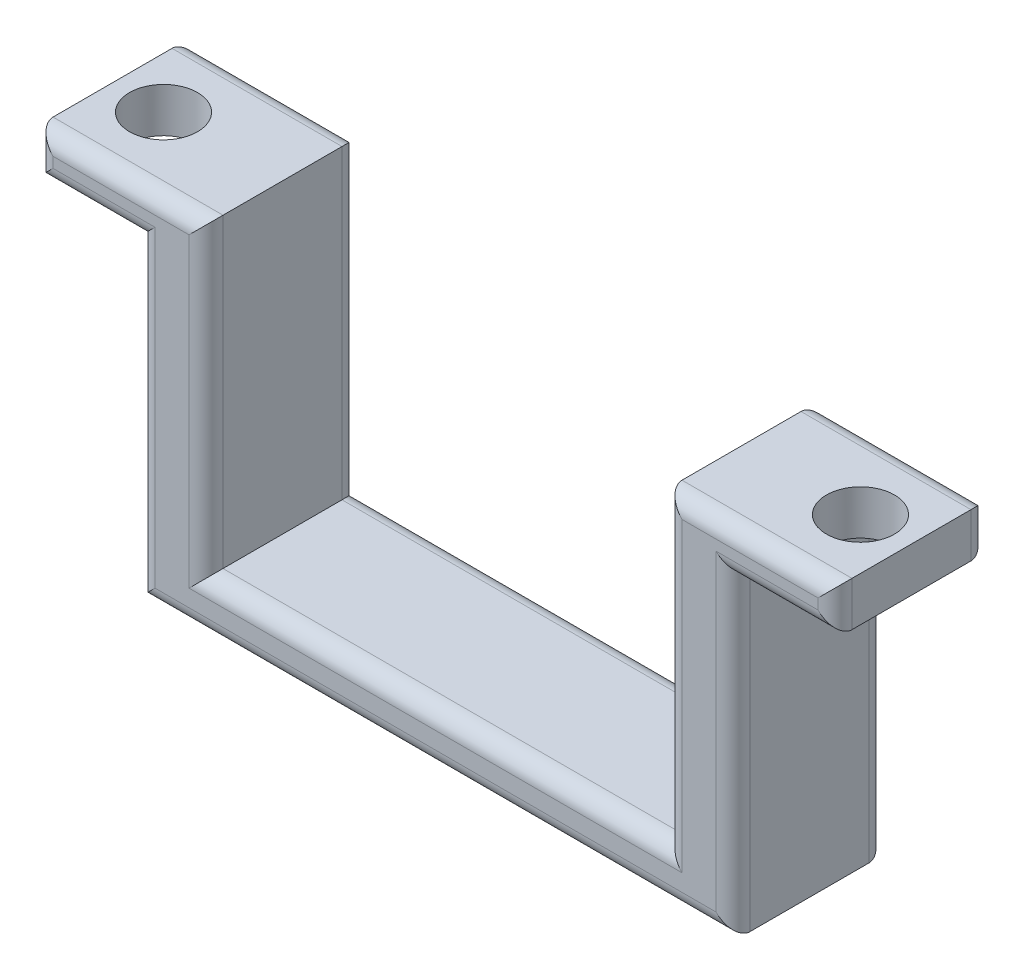
ISO-10303-21;
HEADER;
FILE_DESCRIPTION(('STEP AP214'),'2;1');
FILE_NAME('part.step','',(''),(''),'','','');
FILE_SCHEMA(('AUTOMOTIVE_DESIGN { 1 0 10303 214 1 1 1 1 }'));
ENDSEC;
DATA;
#1=APPLICATION_CONTEXT('core data for automotive mechanical design processes');
#2=APPLICATION_PROTOCOL_DEFINITION('international standard','automotive_design',2000,#1);
#3=PRODUCT_CONTEXT('',#1,'mechanical');
#4=PRODUCT('Part','Part','',(#3));
#5=PRODUCT_RELATED_PRODUCT_CATEGORY('part','',(#4));
#6=PRODUCT_DEFINITION_FORMATION('','',#4);
#7=PRODUCT_DEFINITION_CONTEXT('part definition',#1,'design');
#8=PRODUCT_DEFINITION('design','',#6,#7);
#9=PRODUCT_DEFINITION_SHAPE('','',#8);
#10=(LENGTH_UNIT() NAMED_UNIT(*) SI_UNIT(.MILLI.,.METRE.));
#11=(NAMED_UNIT(*) PLANE_ANGLE_UNIT() SI_UNIT($,.RADIAN.));
#12=(NAMED_UNIT(*) SI_UNIT($,.STERADIAN.) SOLID_ANGLE_UNIT());
#13=UNCERTAINTY_MEASURE_WITH_UNIT(LENGTH_MEASURE(1.E-05),#10,'distance_accuracy_value','');
#14=(GEOMETRIC_REPRESENTATION_CONTEXT(3) GLOBAL_UNCERTAINTY_ASSIGNED_CONTEXT((#13)) GLOBAL_UNIT_ASSIGNED_CONTEXT((#10,
#11,#12)) REPRESENTATION_CONTEXT('',''));
#15=CARTESIAN_POINT('',(0.,0.,0.));
#16=DIRECTION('',(0.,0.,1.));
#17=DIRECTION('',(1.,0.,0.));
#18=AXIS2_PLACEMENT_3D('',#15,#16,#17);
#19=CARTESIAN_POINT('',(0.,-2.61445670320698,9.));
#20=DIRECTION('',(1.,0.,0.));
#21=DIRECTION('',(0.,0.,-1.));
#22=AXIS2_PLACEMENT_3D('',#19,#20,#21);
#23=PLANE('',#22);
#24=DIRECTION('',(0.,0.,-1.));
#25=VECTOR('',#24,1.);
#26=CARTESIAN_POINT('',(0.,0.,9.));
#27=LINE('',#26,#25);
#28=CARTESIAN_POINT('',(0.,0.,8.));
#29=VERTEX_POINT('',#28);
#30=CARTESIAN_POINT('',(0.,0.,0.999999999999999));
#31=VERTEX_POINT('',#30);
#32=EDGE_CURVE('E419',#29,#31,#27,.T.);
#33=ORIENTED_EDGE('',*,*,#32,.T.);
#34=DIRECTION('',(0.,-1.,0.));
#35=VECTOR('',#34,1.);
#36=CARTESIAN_POINT('',(0.,-2.61445670320698,0.999999999999999));
#37=LINE('',#36,#35);
#38=CARTESIAN_POINT('',(0.,-2.61445670320698,0.999999999999999));
#39=VERTEX_POINT('',#38);
#40=EDGE_CURVE('E305',#31,#39,#37,.T.);
#41=ORIENTED_EDGE('',*,*,#40,.T.);
#42=DIRECTION('',(0.,0.,-1.));
#43=VECTOR('',#42,1.);
#44=CARTESIAN_POINT('',(0.,-2.61445670320698,9.));
#45=LINE('',#44,#43);
#46=CARTESIAN_POINT('',(0.,-2.61445670320698,8.));
#47=VERTEX_POINT('',#46);
#48=EDGE_CURVE('E217',#47,#39,#45,.T.);
#49=ORIENTED_EDGE('',*,*,#48,.F.);
#50=DIRECTION('',(0.,-1.,0.));
#51=VECTOR('',#50,1.);
#52=CARTESIAN_POINT('',(0.,-2.61445670320698,8.));
#53=LINE('',#52,#51);
#54=EDGE_CURVE('E303',#47,#29,#53,.F.);
#55=ORIENTED_EDGE('',*,*,#54,.T.);
#56=EDGE_LOOP('',(#33,#41,#49,#55));
#57=FACE_BOUND('',#56,.T.);
#58=ADVANCED_FACE('F33',(#57),#23,.F.);
#59=CARTESIAN_POINT('',(6.,-2.61445670320698,9.));
#60=DIRECTION('',(0.,1.,0.));
#61=DIRECTION('',(-1.,0.,0.));
#62=AXIS2_PLACEMENT_3D('',#59,#60,#61);
#63=PLANE('',#62);
#64=CARTESIAN_POINT('',(3.,-2.61445670320698,4.5));
#65=DIRECTION('',(0.,-1.,0.));
#66=DIRECTION('',(1.,0.,0.));
#67=AXIS2_PLACEMENT_3D('',#64,#65,#66);
#68=CIRCLE('',#67,2.);
#69=CARTESIAN_POINT('',(5.,-2.61445670320698,4.5));
#70=VERTEX_POINT('',#69);
#71=EDGE_CURVE('E420',#70,#70,#68,.T.);
#72=ORIENTED_EDGE('',*,*,#71,.F.);
#73=EDGE_LOOP('',(#72));
#74=FACE_BOUND('',#73,.T.);
#75=ORIENTED_EDGE('',*,*,#48,.T.);
#76=DIRECTION('',(1.,0.,0.));
#77=VECTOR('',#76,1.);
#78=CARTESIAN_POINT('',(6.,-2.61445670320698,0.999999999999999));
#79=LINE('',#78,#77);
#80=CARTESIAN_POINT('',(6.,-2.61445670320698,0.999999999999999));
#81=VERTEX_POINT('',#80);
#82=EDGE_CURVE('E216',#39,#81,#79,.T.);
#83=ORIENTED_EDGE('',*,*,#82,.T.);
#84=DIRECTION('',(0.,0.,-1.));
#85=VECTOR('',#84,1.);
#86=CARTESIAN_POINT('',(6.,-2.61445670320698,9.));
#87=LINE('',#86,#85);
#88=CARTESIAN_POINT('',(6.,-2.61445670320698,8.));
#89=VERTEX_POINT('',#88);
#90=EDGE_CURVE('E198',#89,#81,#87,.T.);
#91=ORIENTED_EDGE('',*,*,#90,.F.);
#92=DIRECTION('',(1.,0.,0.));
#93=VECTOR('',#92,1.);
#94=CARTESIAN_POINT('',(6.,-2.61445670320698,8.));
#95=LINE('',#94,#93);
#96=EDGE_CURVE('E213',#89,#47,#95,.F.);
#97=ORIENTED_EDGE('',*,*,#96,.T.);
#98=EDGE_LOOP('',(#75,#83,#91,#97));
#99=FACE_BOUND('',#98,.T.);
#100=ADVANCED_FACE('F211',(#74,#99),#63,.F.);
#101=CARTESIAN_POINT('',(6.,-21.,9.));
#102=DIRECTION('',(1.,0.,0.));
#103=DIRECTION('',(0.,0.,-1.));
#104=AXIS2_PLACEMENT_3D('',#101,#102,#103);
#105=PLANE('',#104);
#106=ORIENTED_EDGE('',*,*,#90,.T.);
#107=DIRECTION('',(0.,-1.,0.));
#108=VECTOR('',#107,1.);
#109=CARTESIAN_POINT('',(6.,-21.,0.999999999999999));
#110=LINE('',#109,#108);
#111=CARTESIAN_POINT('',(6.,-21.,0.999999999999999));
#112=VERTEX_POINT('',#111);
#113=EDGE_CURVE('E205',#81,#112,#110,.T.);
#114=ORIENTED_EDGE('',*,*,#113,.T.);
#115=DIRECTION('',(0.,0.,-1.));
#116=VECTOR('',#115,1.);
#117=CARTESIAN_POINT('',(6.,-21.,9.));
#118=LINE('',#117,#116);
#119=CARTESIAN_POINT('',(6.,-21.,8.));
#120=VERTEX_POINT('',#119);
#121=EDGE_CURVE('E200',#120,#112,#118,.T.);
#122=ORIENTED_EDGE('',*,*,#121,.F.);
#123=DIRECTION('',(0.,-1.,0.));
#124=VECTOR('',#123,1.);
#125=CARTESIAN_POINT('',(6.,-21.,8.));
#126=LINE('',#125,#124);
#127=EDGE_CURVE('E195',#120,#89,#126,.F.);
#128=ORIENTED_EDGE('',*,*,#127,.T.);
#129=EDGE_LOOP('',(#106,#114,#122,#128));
#130=FACE_BOUND('',#129,.T.);
#131=ADVANCED_FACE('F197',(#130),#105,.F.);
#132=CARTESIAN_POINT('',(41.,-21.,9.));
#133=DIRECTION('',(0.,1.,0.));
#134=DIRECTION('',(-1.,0.,0.));
#135=AXIS2_PLACEMENT_3D('',#132,#133,#134);
#136=PLANE('',#135);
#137=ORIENTED_EDGE('',*,*,#121,.T.);
#138=DIRECTION('',(1.,0.,0.));
#139=VECTOR('',#138,1.);
#140=CARTESIAN_POINT('',(41.,-21.,0.999999999999999));
#141=LINE('',#140,#139);
#142=CARTESIAN_POINT('',(41.,-21.,0.999999999999999));
#143=VERTEX_POINT('',#142);
#144=EDGE_CURVE('E268',#112,#143,#141,.T.);
#145=ORIENTED_EDGE('',*,*,#144,.T.);
#146=DIRECTION('',(0.,0.,-1.));
#147=VECTOR('',#146,1.);
#148=CARTESIAN_POINT('',(41.,-21.,9.));
#149=LINE('',#148,#147);
#150=CARTESIAN_POINT('',(41.,-21.,8.));
#151=VERTEX_POINT('',#150);
#152=EDGE_CURVE('E410',#151,#143,#149,.T.);
#153=ORIENTED_EDGE('',*,*,#152,.F.);
#154=DIRECTION('',(1.,0.,0.));
#155=VECTOR('',#154,1.);
#156=CARTESIAN_POINT('',(41.,-21.,8.));
#157=LINE('',#156,#155);
#158=EDGE_CURVE('E266',#151,#120,#157,.F.);
#159=ORIENTED_EDGE('',*,*,#158,.T.);
#160=EDGE_LOOP('',(#137,#145,#153,#159));
#161=FACE_BOUND('',#160,.T.);
#162=ADVANCED_FACE('F521',(#161),#136,.F.);
#163=CARTESIAN_POINT('',(41.,-2.61445670320697,9.));
#164=DIRECTION('',(-1.,0.,0.));
#165=DIRECTION('',(0.,0.,1.));
#166=AXIS2_PLACEMENT_3D('',#163,#164,#165);
#167=PLANE('',#166);
#168=ORIENTED_EDGE('',*,*,#152,.T.);
#169=DIRECTION('',(0.,1.,0.));
#170=VECTOR('',#169,1.);
#171=CARTESIAN_POINT('',(41.,-2.61445670320697,0.999999999999999));
#172=LINE('',#171,#170);
#173=CARTESIAN_POINT('',(41.,-2.61445670320697,0.999999999999999));
#174=VERTEX_POINT('',#173);
#175=EDGE_CURVE('E272',#143,#174,#172,.T.);
#176=ORIENTED_EDGE('',*,*,#175,.T.);
#177=DIRECTION('',(0.,0.,-1.));
#178=VECTOR('',#177,1.);
#179=CARTESIAN_POINT('',(41.,-2.61445670320697,9.));
#180=LINE('',#179,#178);
#181=CARTESIAN_POINT('',(41.,-2.61445670320697,8.));
#182=VERTEX_POINT('',#181);
#183=EDGE_CURVE('E401',#182,#174,#180,.T.);
#184=ORIENTED_EDGE('',*,*,#183,.F.);
#185=DIRECTION('',(0.,1.,0.));
#186=VECTOR('',#185,1.);
#187=CARTESIAN_POINT('',(41.,-2.61445670320697,8.));
#188=LINE('',#187,#186);
#189=EDGE_CURVE('E270',#182,#151,#188,.F.);
#190=ORIENTED_EDGE('',*,*,#189,.T.);
#191=EDGE_LOOP('',(#168,#176,#184,#190));
#192=FACE_BOUND('',#191,.T.);
#193=ADVANCED_FACE('F407',(#192),#167,.F.);
#194=CARTESIAN_POINT('',(47.,-2.61445670320697,9.));
#195=DIRECTION('',(0.,1.,0.));
#196=DIRECTION('',(-1.,0.,0.));
#197=AXIS2_PLACEMENT_3D('',#194,#195,#196);
#198=PLANE('',#197);
#199=CARTESIAN_POINT('',(44.,-2.61445670320698,4.5));
#200=DIRECTION('',(0.,1.,0.));
#201=DIRECTION('',(-1.,0.,0.));
#202=AXIS2_PLACEMENT_3D('',#199,#200,#201);
#203=CIRCLE('',#202,2.);
#204=CARTESIAN_POINT('',(42.,-2.61445670320698,4.5));
#205=VERTEX_POINT('',#204);
#206=EDGE_CURVE('E360',#205,#205,#203,.T.);
#207=ORIENTED_EDGE('',*,*,#206,.T.);
#208=EDGE_LOOP('',(#207));
#209=FACE_BOUND('',#208,.T.);
#210=ORIENTED_EDGE('',*,*,#183,.T.);
#211=DIRECTION('',(1.,0.,0.));
#212=VECTOR('',#211,1.);
#213=CARTESIAN_POINT('',(47.,-2.61445670320697,0.999999999999999));
#214=LINE('',#213,#212);
#215=CARTESIAN_POINT('',(47.,-2.61445670320697,0.999999999999999));
#216=VERTEX_POINT('',#215);
#217=EDGE_CURVE('E276',#174,#216,#214,.T.);
#218=ORIENTED_EDGE('',*,*,#217,.T.);
#219=DIRECTION('',(0.,0.,-1.));
#220=VECTOR('',#219,1.);
#221=CARTESIAN_POINT('',(47.,-2.61445670320697,9.));
#222=LINE('',#221,#220);
#223=CARTESIAN_POINT('',(47.,-2.61445670320697,8.));
#224=VERTEX_POINT('',#223);
#225=EDGE_CURVE('E404',#224,#216,#222,.T.);
#226=ORIENTED_EDGE('',*,*,#225,.F.);
#227=DIRECTION('',(1.,0.,0.));
#228=VECTOR('',#227,1.);
#229=CARTESIAN_POINT('',(47.,-2.61445670320697,8.));
#230=LINE('',#229,#228);
#231=EDGE_CURVE('E274',#224,#182,#230,.F.);
#232=ORIENTED_EDGE('',*,*,#231,.T.);
#233=EDGE_LOOP('',(#210,#218,#226,#232));
#234=FACE_BOUND('',#233,.T.);
#235=ADVANCED_FACE('F400',(#209,#234),#198,.F.);
#236=CARTESIAN_POINT('',(47.,0.,9.));
#237=DIRECTION('',(-1.,0.,0.));
#238=DIRECTION('',(0.,0.,1.));
#239=AXIS2_PLACEMENT_3D('',#236,#237,#238);
#240=PLANE('',#239);
#241=ORIENTED_EDGE('',*,*,#225,.T.);
#242=DIRECTION('',(0.,1.,0.));
#243=VECTOR('',#242,1.);
#244=CARTESIAN_POINT('',(47.,0.,0.999999999999999));
#245=LINE('',#244,#243);
#246=CARTESIAN_POINT('',(47.,0.,0.999999999999999));
#247=VERTEX_POINT('',#246);
#248=EDGE_CURVE('E280',#216,#247,#245,.T.);
#249=ORIENTED_EDGE('',*,*,#248,.T.);
#250=DIRECTION('',(0.,0.,-1.));
#251=VECTOR('',#250,1.);
#252=CARTESIAN_POINT('',(47.,0.,9.));
#253=LINE('',#252,#251);
#254=CARTESIAN_POINT('',(47.,0.,8.));
#255=VERTEX_POINT('',#254);
#256=EDGE_CURVE('E413',#255,#247,#253,.T.);
#257=ORIENTED_EDGE('',*,*,#256,.F.);
#258=DIRECTION('',(0.,1.,0.));
#259=VECTOR('',#258,1.);
#260=CARTESIAN_POINT('',(47.,0.,8.));
#261=LINE('',#260,#259);
#262=EDGE_CURVE('E278',#255,#224,#261,.F.);
#263=ORIENTED_EDGE('',*,*,#262,.T.);
#264=EDGE_LOOP('',(#241,#249,#257,#263));
#265=FACE_BOUND('',#264,.T.);
#266=ADVANCED_FACE('F532',(#265),#240,.F.);
#267=CARTESIAN_POINT('',(37.,0.,9.));
#268=DIRECTION('',(0.,-1.,0.));
#269=DIRECTION('',(0.,0.,-1.));
#270=AXIS2_PLACEMENT_3D('',#267,#268,#269);
#271=PLANE('',#270);
#272=CARTESIAN_POINT('',(44.,0.,4.5));
#273=DIRECTION('',(0.,-1.,0.));
#274=DIRECTION('',(0.,0.,-1.));
#275=AXIS2_PLACEMENT_3D('',#272,#273,#274);
#276=CIRCLE('',#275,2.);
#277=CARTESIAN_POINT('',(44.,0.,2.5));
#278=VERTEX_POINT('',#277);
#279=EDGE_CURVE('E239',#278,#278,#276,.F.);
#280=ORIENTED_EDGE('',*,*,#279,.F.);
#281=EDGE_LOOP('',(#280));
#282=FACE_BOUND('',#281,.T.);
#283=ORIENTED_EDGE('',*,*,#256,.T.);
#284=DIRECTION('',(-1.,0.,0.));
#285=VECTOR('',#284,1.);
#286=CARTESIAN_POINT('',(37.,0.,0.999999999999999));
#287=LINE('',#286,#285);
#288=CARTESIAN_POINT('',(37.,0.,0.999999999999999));
#289=VERTEX_POINT('',#288);
#290=EDGE_CURVE('E284',#247,#289,#287,.T.);
#291=ORIENTED_EDGE('',*,*,#290,.T.);
#292=DIRECTION('',(0.,0.,-1.));
#293=VECTOR('',#292,1.);
#294=CARTESIAN_POINT('',(37.,0.,9.));
#295=LINE('',#294,#293);
#296=CARTESIAN_POINT('',(37.,0.,8.));
#297=VERTEX_POINT('',#296);
#298=EDGE_CURVE('E441',#297,#289,#295,.T.);
#299=ORIENTED_EDGE('',*,*,#298,.F.);
#300=DIRECTION('',(-1.,0.,0.));
#301=VECTOR('',#300,1.);
#302=CARTESIAN_POINT('',(37.,0.,8.));
#303=LINE('',#302,#301);
#304=EDGE_CURVE('E282',#297,#255,#303,.F.);
#305=ORIENTED_EDGE('',*,*,#304,.T.);
#306=EDGE_LOOP('',(#283,#291,#299,#305));
#307=FACE_BOUND('',#306,.T.);
#308=ADVANCED_FACE('F447',(#282,#307),#271,.F.);
#309=CARTESIAN_POINT('',(37.,-18.,9.));
#310=DIRECTION('',(1.,0.,0.));
#311=DIRECTION('',(0.,0.,-1.));
#312=AXIS2_PLACEMENT_3D('',#309,#310,#311);
#313=PLANE('',#312);
#314=ORIENTED_EDGE('',*,*,#298,.T.);
#315=DIRECTION('',(0.,-1.,0.));
#316=VECTOR('',#315,1.);
#317=CARTESIAN_POINT('',(37.,-18.,0.999999999999999));
#318=LINE('',#317,#316);
#319=CARTESIAN_POINT('',(37.,-18.,0.999999999999999));
#320=VERTEX_POINT('',#319);
#321=EDGE_CURVE('E288',#289,#320,#318,.T.);
#322=ORIENTED_EDGE('',*,*,#321,.T.);
#323=DIRECTION('',(0.,0.,-1.));
#324=VECTOR('',#323,1.);
#325=CARTESIAN_POINT('',(37.,-18.,9.));
#326=LINE('',#325,#324);
#327=CARTESIAN_POINT('',(37.,-18.,8.));
#328=VERTEX_POINT('',#327);
#329=EDGE_CURVE('E438',#328,#320,#326,.T.);
#330=ORIENTED_EDGE('',*,*,#329,.F.);
#331=DIRECTION('',(0.,-1.,0.));
#332=VECTOR('',#331,1.);
#333=CARTESIAN_POINT('',(37.,-18.,8.));
#334=LINE('',#333,#332);
#335=EDGE_CURVE('E286',#328,#297,#334,.F.);
#336=ORIENTED_EDGE('',*,*,#335,.T.);
#337=EDGE_LOOP('',(#314,#322,#330,#336));
#338=FACE_BOUND('',#337,.T.);
#339=ADVANCED_FACE('F473',(#338),#313,.F.);
#340=CARTESIAN_POINT('',(10.,-18.,9.));
#341=DIRECTION('',(0.,-1.,0.));
#342=DIRECTION('',(0.,0.,-1.));
#343=AXIS2_PLACEMENT_3D('',#340,#341,#342);
#344=PLANE('',#343);
#345=ORIENTED_EDGE('',*,*,#329,.T.);
#346=DIRECTION('',(-1.,0.,0.));
#347=VECTOR('',#346,1.);
#348=CARTESIAN_POINT('',(10.,-18.,0.999999999999999));
#349=LINE('',#348,#347);
#350=CARTESIAN_POINT('',(10.,-18.,0.999999999999999));
#351=VERTEX_POINT('',#350);
#352=EDGE_CURVE('E292',#320,#351,#349,.T.);
#353=ORIENTED_EDGE('',*,*,#352,.T.);
#354=DIRECTION('',(0.,0.,-1.));
#355=VECTOR('',#354,1.);
#356=CARTESIAN_POINT('',(10.,-18.,9.));
#357=LINE('',#356,#355);
#358=CARTESIAN_POINT('',(10.,-18.,8.));
#359=VERTEX_POINT('',#358);
#360=EDGE_CURVE('E435',#359,#351,#357,.T.);
#361=ORIENTED_EDGE('',*,*,#360,.F.);
#362=DIRECTION('',(-1.,0.,0.));
#363=VECTOR('',#362,1.);
#364=CARTESIAN_POINT('',(10.,-18.,8.));
#365=LINE('',#364,#363);
#366=EDGE_CURVE('E290',#359,#328,#365,.F.);
#367=ORIENTED_EDGE('',*,*,#366,.T.);
#368=EDGE_LOOP('',(#345,#353,#361,#367));
#369=FACE_BOUND('',#368,.T.);
#370=ADVANCED_FACE('F476',(#369),#344,.F.);
#371=CARTESIAN_POINT('',(10.,0.,9.));
#372=DIRECTION('',(-1.,0.,0.));
#373=DIRECTION('',(0.,-1.,0.));
#374=AXIS2_PLACEMENT_3D('',#371,#372,#373);
#375=PLANE('',#374);
#376=ORIENTED_EDGE('',*,*,#360,.T.);
#377=DIRECTION('',(0.,1.,0.));
#378=VECTOR('',#377,1.);
#379=CARTESIAN_POINT('',(10.,0.,0.999999999999999));
#380=LINE('',#379,#378);
#381=CARTESIAN_POINT('',(10.,0.,0.999999999999999));
#382=VERTEX_POINT('',#381);
#383=EDGE_CURVE('E296',#351,#382,#380,.T.);
#384=ORIENTED_EDGE('',*,*,#383,.T.);
#385=DIRECTION('',(0.,0.,-1.));
#386=VECTOR('',#385,1.);
#387=CARTESIAN_POINT('',(10.,0.,9.));
#388=LINE('',#387,#386);
#389=CARTESIAN_POINT('',(10.,0.,8.));
#390=VERTEX_POINT('',#389);
#391=EDGE_CURVE('E424',#390,#382,#388,.T.);
#392=ORIENTED_EDGE('',*,*,#391,.F.);
#393=DIRECTION('',(0.,1.,0.));
#394=VECTOR('',#393,1.);
#395=CARTESIAN_POINT('',(10.,0.,8.));
#396=LINE('',#395,#394);
#397=EDGE_CURVE('E294',#390,#359,#396,.F.);
#398=ORIENTED_EDGE('',*,*,#397,.T.);
#399=EDGE_LOOP('',(#376,#384,#392,#398));
#400=FACE_BOUND('',#399,.T.);
#401=ADVANCED_FACE('F693',(#400),#375,.F.);
#402=CARTESIAN_POINT('',(0.,0.,9.));
#403=DIRECTION('',(0.,-1.,0.));
#404=DIRECTION('',(0.,0.,-1.));
#405=AXIS2_PLACEMENT_3D('',#402,#403,#404);
#406=PLANE('',#405);
#407=CARTESIAN_POINT('',(3.,0.,4.5));
#408=DIRECTION('',(0.,-1.,0.));
#409=DIRECTION('',(0.,0.,-1.));
#410=AXIS2_PLACEMENT_3D('',#407,#408,#409);
#411=CIRCLE('',#410,2.);
#412=CARTESIAN_POINT('',(3.,0.,2.5));
#413=VERTEX_POINT('',#412);
#414=EDGE_CURVE('E417',#413,#413,#411,.T.);
#415=ORIENTED_EDGE('',*,*,#414,.T.);
#416=EDGE_LOOP('',(#415));
#417=FACE_BOUND('',#416,.T.);
#418=ORIENTED_EDGE('',*,*,#391,.T.);
#419=DIRECTION('',(-1.,0.,0.));
#420=VECTOR('',#419,1.);
#421=CARTESIAN_POINT('',(0.,0.,0.999999999999999));
#422=LINE('',#421,#420);
#423=EDGE_CURVE('E301',#382,#31,#422,.T.);
#424=ORIENTED_EDGE('',*,*,#423,.T.);
#425=ORIENTED_EDGE('',*,*,#32,.F.);
#426=DIRECTION('',(-1.,0.,0.));
#427=VECTOR('',#426,1.);
#428=CARTESIAN_POINT('',(0.,0.,8.));
#429=LINE('',#428,#427);
#430=EDGE_CURVE('E298',#29,#390,#429,.F.);
#431=ORIENTED_EDGE('',*,*,#430,.T.);
#432=EDGE_LOOP('',(#418,#424,#425,#431));
#433=FACE_BOUND('',#432,.T.);
#434=ADVANCED_FACE('F498',(#417,#433),#406,.F.);
#435=CARTESIAN_POINT('',(0.,0.,9.));
#436=DIRECTION('',(0.,0.,-1.));
#437=DIRECTION('',(-1.,0.,0.));
#438=AXIS2_PLACEMENT_3D('',#435,#436,#437);
#439=PLANE('',#438);
#440=DIRECTION('',(0.,1.,0.));
#441=VECTOR('',#440,1.);
#442=CARTESIAN_POINT('',(9.,0.,9.));
#443=LINE('',#442,#441);
#444=CARTESIAN_POINT('',(9.,-19.,9.));
#445=VERTEX_POINT('',#444);
#446=CARTESIAN_POINT('',(9.,-1.,9.));
#447=VERTEX_POINT('',#446);
#448=EDGE_CURVE('E42',#445,#447,#443,.T.);
#449=ORIENTED_EDGE('',*,*,#448,.T.);
#450=DIRECTION('',(-1.,0.,0.));
#451=VECTOR('',#450,1.);
#452=CARTESIAN_POINT('',(0.,-1.,9.));
#453=LINE('',#452,#451);
#454=CARTESIAN_POINT('',(1.,-1.,9.));
#455=VERTEX_POINT('',#454);
#456=EDGE_CURVE('E11',#447,#455,#453,.T.);
#457=ORIENTED_EDGE('',*,*,#456,.T.);
#458=DIRECTION('',(0.,-1.,0.));
#459=VECTOR('',#458,1.);
#460=CARTESIAN_POINT('',(1.,0.,9.));
#461=LINE('',#460,#459);
#462=CARTESIAN_POINT('',(1.,-1.61445670320698,9.));
#463=VERTEX_POINT('',#462);
#464=EDGE_CURVE('E307',#455,#463,#461,.T.);
#465=ORIENTED_EDGE('',*,*,#464,.T.);
#466=DIRECTION('',(1.,0.,0.));
#467=VECTOR('',#466,1.);
#468=CARTESIAN_POINT('',(0.,-1.61445670320698,9.));
#469=LINE('',#468,#467);
#470=CARTESIAN_POINT('',(7.,-1.61445670320698,9.));
#471=VERTEX_POINT('',#470);
#472=EDGE_CURVE('E309',#463,#471,#469,.T.);
#473=ORIENTED_EDGE('',*,*,#472,.T.);
#474=DIRECTION('',(0.,-1.,0.));
#475=VECTOR('',#474,1.);
#476=CARTESIAN_POINT('',(7.,0.,9.));
#477=LINE('',#476,#475);
#478=CARTESIAN_POINT('',(7.,-20.,9.));
#479=VERTEX_POINT('',#478);
#480=EDGE_CURVE('E223',#471,#479,#477,.T.);
#481=ORIENTED_EDGE('',*,*,#480,.T.);
#482=DIRECTION('',(1.,0.,0.));
#483=VECTOR('',#482,1.);
#484=CARTESIAN_POINT('',(0.,-20.,9.));
#485=LINE('',#484,#483);
#486=CARTESIAN_POINT('',(40.,-20.,9.));
#487=VERTEX_POINT('',#486);
#488=EDGE_CURVE('E312',#479,#487,#485,.T.);
#489=ORIENTED_EDGE('',*,*,#488,.T.);
#490=DIRECTION('',(0.,1.,0.));
#491=VECTOR('',#490,1.);
#492=CARTESIAN_POINT('',(40.,0.,9.));
#493=LINE('',#492,#491);
#494=CARTESIAN_POINT('',(40.,-1.61445670320697,9.));
#495=VERTEX_POINT('',#494);
#496=EDGE_CURVE('E314',#487,#495,#493,.T.);
#497=ORIENTED_EDGE('',*,*,#496,.T.);
#498=DIRECTION('',(1.,0.,0.));
#499=VECTOR('',#498,1.);
#500=CARTESIAN_POINT('',(0.,-1.61445670320698,9.));
#501=LINE('',#500,#499);
#502=CARTESIAN_POINT('',(46.,-1.61445670320697,9.));
#503=VERTEX_POINT('',#502);
#504=EDGE_CURVE('E316',#495,#503,#501,.T.);
#505=ORIENTED_EDGE('',*,*,#504,.T.);
#506=DIRECTION('',(0.,1.,0.));
#507=VECTOR('',#506,1.);
#508=CARTESIAN_POINT('',(46.,0.,9.));
#509=LINE('',#508,#507);
#510=CARTESIAN_POINT('',(46.,-1.,9.));
#511=VERTEX_POINT('',#510);
#512=EDGE_CURVE('E318',#503,#511,#509,.T.);
#513=ORIENTED_EDGE('',*,*,#512,.T.);
#514=DIRECTION('',(-1.,0.,0.));
#515=VECTOR('',#514,1.);
#516=CARTESIAN_POINT('',(0.,-1.,9.));
#517=LINE('',#516,#515);
#518=CARTESIAN_POINT('',(38.,-1.,9.));
#519=VERTEX_POINT('',#518);
#520=EDGE_CURVE('E320',#511,#519,#517,.T.);
#521=ORIENTED_EDGE('',*,*,#520,.T.);
#522=DIRECTION('',(0.,-1.,0.));
#523=VECTOR('',#522,1.);
#524=CARTESIAN_POINT('',(38.,0.,9.));
#525=LINE('',#524,#523);
#526=CARTESIAN_POINT('',(38.,-19.,9.));
#527=VERTEX_POINT('',#526);
#528=EDGE_CURVE('E322',#519,#527,#525,.T.);
#529=ORIENTED_EDGE('',*,*,#528,.T.);
#530=DIRECTION('',(-1.,0.,0.));
#531=VECTOR('',#530,1.);
#532=CARTESIAN_POINT('',(0.,-19.,9.));
#533=LINE('',#532,#531);
#534=EDGE_CURVE('E53',#527,#445,#533,.T.);
#535=ORIENTED_EDGE('',*,*,#534,.T.);
#536=EDGE_LOOP('',(#449,#457,#465,#473,#481,#489,#497,#505,#513,#521,#529,#535));
#537=FACE_BOUND('',#536,.T.);
#538=ADVANCED_FACE('F491',(#537),#439,.F.);
#539=CARTESIAN_POINT('',(0.,0.,0.));
#540=DIRECTION('',(0.,0.,-1.));
#541=DIRECTION('',(-1.,0.,0.));
#542=AXIS2_PLACEMENT_3D('',#539,#540,#541);
#543=PLANE('',#542);
#544=DIRECTION('',(0.,-1.,0.));
#545=VECTOR('',#544,1.);
#546=CARTESIAN_POINT('',(7.,-2.61445670320698,0.));
#547=LINE('',#546,#545);
#548=CARTESIAN_POINT('',(7.,-20.,0.));
#549=VERTEX_POINT('',#548);
#550=CARTESIAN_POINT('',(7.,-1.61445670320698,0.));
#551=VERTEX_POINT('',#550);
#552=EDGE_CURVE('E261',#549,#551,#547,.F.);
#553=ORIENTED_EDGE('',*,*,#552,.T.);
#554=DIRECTION('',(1.,0.,0.));
#555=VECTOR('',#554,1.);
#556=CARTESIAN_POINT('',(0.,-1.61445670320698,0.));
#557=LINE('',#556,#555);
#558=CARTESIAN_POINT('',(1.,-1.61445670320698,0.));
#559=VERTEX_POINT('',#558);
#560=EDGE_CURVE('E206',#551,#559,#557,.F.);
#561=ORIENTED_EDGE('',*,*,#560,.T.);
#562=DIRECTION('',(0.,-1.,0.));
#563=VECTOR('',#562,1.);
#564=CARTESIAN_POINT('',(1.,0.,0.));
#565=LINE('',#564,#563);
#566=CARTESIAN_POINT('',(1.,-1.,0.));
#567=VERTEX_POINT('',#566);
#568=EDGE_CURVE('E235',#559,#567,#565,.F.);
#569=ORIENTED_EDGE('',*,*,#568,.T.);
#570=DIRECTION('',(-1.,0.,0.));
#571=VECTOR('',#570,1.);
#572=CARTESIAN_POINT('',(10.,-1.,0.));
#573=LINE('',#572,#571);
#574=CARTESIAN_POINT('',(9.,-1.,0.));
#575=VERTEX_POINT('',#574);
#576=EDGE_CURVE('E243',#567,#575,#573,.F.);
#577=ORIENTED_EDGE('',*,*,#576,.T.);
#578=DIRECTION('',(0.,1.,0.));
#579=VECTOR('',#578,1.);
#580=CARTESIAN_POINT('',(9.,-18.,0.));
#581=LINE('',#580,#579);
#582=CARTESIAN_POINT('',(9.,-19.,0.));
#583=VERTEX_POINT('',#582);
#584=EDGE_CURVE('E245',#575,#583,#581,.F.);
#585=ORIENTED_EDGE('',*,*,#584,.T.);
#586=DIRECTION('',(-1.,0.,0.));
#587=VECTOR('',#586,1.);
#588=CARTESIAN_POINT('',(37.,-19.,0.));
#589=LINE('',#588,#587);
#590=CARTESIAN_POINT('',(38.,-19.,0.));
#591=VERTEX_POINT('',#590);
#592=EDGE_CURVE('E247',#583,#591,#589,.F.);
#593=ORIENTED_EDGE('',*,*,#592,.T.);
#594=DIRECTION('',(0.,-1.,0.));
#595=VECTOR('',#594,1.);
#596=CARTESIAN_POINT('',(38.,0.,0.));
#597=LINE('',#596,#595);
#598=CARTESIAN_POINT('',(38.,-1.,0.));
#599=VERTEX_POINT('',#598);
#600=EDGE_CURVE('E249',#591,#599,#597,.F.);
#601=ORIENTED_EDGE('',*,*,#600,.T.);
#602=DIRECTION('',(-1.,0.,0.));
#603=VECTOR('',#602,1.);
#604=CARTESIAN_POINT('',(47.,-1.,0.));
#605=LINE('',#604,#603);
#606=CARTESIAN_POINT('',(46.,-1.,0.));
#607=VERTEX_POINT('',#606);
#608=EDGE_CURVE('E251',#599,#607,#605,.F.);
#609=ORIENTED_EDGE('',*,*,#608,.T.);
#610=DIRECTION('',(0.,1.,0.));
#611=VECTOR('',#610,1.);
#612=CARTESIAN_POINT('',(46.,-2.61445670320697,0.));
#613=LINE('',#612,#611);
#614=CARTESIAN_POINT('',(46.,-1.61445670320697,0.));
#615=VERTEX_POINT('',#614);
#616=EDGE_CURVE('E253',#607,#615,#613,.F.);
#617=ORIENTED_EDGE('',*,*,#616,.T.);
#618=DIRECTION('',(1.,0.,0.));
#619=VECTOR('',#618,1.);
#620=CARTESIAN_POINT('',(41.,-1.61445670320697,0.));
#621=LINE('',#620,#619);
#622=CARTESIAN_POINT('',(40.,-1.61445670320697,0.));
#623=VERTEX_POINT('',#622);
#624=EDGE_CURVE('E255',#615,#623,#621,.F.);
#625=ORIENTED_EDGE('',*,*,#624,.T.);
#626=DIRECTION('',(0.,1.,0.));
#627=VECTOR('',#626,1.);
#628=CARTESIAN_POINT('',(40.,-21.,0.));
#629=LINE('',#628,#627);
#630=CARTESIAN_POINT('',(40.,-20.,0.));
#631=VERTEX_POINT('',#630);
#632=EDGE_CURVE('E257',#623,#631,#629,.F.);
#633=ORIENTED_EDGE('',*,*,#632,.T.);
#634=DIRECTION('',(1.,0.,0.));
#635=VECTOR('',#634,1.);
#636=CARTESIAN_POINT('',(6.,-20.,0.));
#637=LINE('',#636,#635);
#638=EDGE_CURVE('E259',#631,#549,#637,.F.);
#639=ORIENTED_EDGE('',*,*,#638,.T.);
#640=EDGE_LOOP('',(#553,#561,#569,#577,#585,#593,#601,#609,#617,#625,#633,#639));
#641=FACE_BOUND('',#640,.T.);
#642=ADVANCED_FACE('F464',(#641),#543,.T.);
#643=CARTESIAN_POINT('',(3.,6.38554329679302,4.5));
#644=DIRECTION('',(0.,-1.,0.));
#645=DIRECTION('',(1.,0.,0.));
#646=AXIS2_PLACEMENT_3D('',#643,#644,#645);
#647=CYLINDRICAL_SURFACE('',#646,2.);
#648=ORIENTED_EDGE('',*,*,#71,.T.);
#649=EDGE_LOOP('',(#648));
#650=FACE_BOUND('',#649,.T.);
#651=ORIENTED_EDGE('',*,*,#414,.F.);
#652=EDGE_LOOP('',(#651));
#653=FACE_BOUND('',#652,.T.);
#654=ADVANCED_FACE('F668',(#650,#653),#647,.F.);
#655=CARTESIAN_POINT('',(44.,6.38554329679302,4.5));
#656=DIRECTION('',(0.,-1.,0.));
#657=DIRECTION('',(1.,0.,0.));
#658=AXIS2_PLACEMENT_3D('',#655,#656,#657);
#659=CYLINDRICAL_SURFACE('',#658,2.);
#660=ORIENTED_EDGE('',*,*,#206,.F.);
#661=EDGE_LOOP('',(#660));
#662=FACE_BOUND('',#661,.T.);
#663=ORIENTED_EDGE('',*,*,#279,.T.);
#664=EDGE_LOOP('',(#663));
#665=FACE_BOUND('',#664,.T.);
#666=ADVANCED_FACE('F580',(#662,#665),#659,.F.);
#667=CARTESIAN_POINT('',(37.,-1.,0.999999999999999));
#668=DIRECTION('',(1.,0.,0.));
#669=DIRECTION('',(0.,0.,-1.));
#670=AXIS2_PLACEMENT_3D('',#667,#668,#669);
#671=CYLINDRICAL_SURFACE('',#670,1.);
#672=CARTESIAN_POINT('',(46.,-1.,0.999999999999999));
#673=DIRECTION('',(0.707106781186547,-0.707106781186547,0.));
#674=DIRECTION('',(0.707106781186547,0.707106781186547,0.));
#675=AXIS2_PLACEMENT_3D('',#672,#673,#674);
#676=ELLIPSE('',#675,1.41421356237309,1.);
#677=EDGE_CURVE('E354',#607,#247,#676,.T.);
#678=ORIENTED_EDGE('',*,*,#677,.F.);
#679=ORIENTED_EDGE('',*,*,#608,.F.);
#680=CARTESIAN_POINT('',(38.,-1.,0.999999999999999));
#681=DIRECTION('',(0.707106781186547,0.707106781186547,0.));
#682=DIRECTION('',(-0.707106781186547,0.707106781186547,0.));
#683=AXIS2_PLACEMENT_3D('',#680,#681,#682);
#684=ELLIPSE('',#683,1.41421356237309,1.);
#685=EDGE_CURVE('E357',#289,#599,#684,.F.);
#686=ORIENTED_EDGE('',*,*,#685,.F.);
#687=ORIENTED_EDGE('',*,*,#290,.F.);
#688=EDGE_LOOP('',(#678,#679,#686,#687));
#689=FACE_BOUND('',#688,.T.);
#690=ADVANCED_FACE('F454',(#689),#671,.T.);
#691=CARTESIAN_POINT('',(38.,-18.,0.999999999999999));
#692=DIRECTION('',(0.,1.,0.));
#693=DIRECTION('',(0.,0.,1.));
#694=AXIS2_PLACEMENT_3D('',#691,#692,#693);
#695=CYLINDRICAL_SURFACE('',#694,1.);
#696=ORIENTED_EDGE('',*,*,#685,.T.);
#697=ORIENTED_EDGE('',*,*,#600,.F.);
#698=CARTESIAN_POINT('',(38.,-19.,0.999999999999999));
#699=DIRECTION('',(0.707106781186547,0.707106781186547,0.));
#700=DIRECTION('',(-0.707106781186547,0.707106781186547,0.));
#701=AXIS2_PLACEMENT_3D('',#698,#699,#700);
#702=ELLIPSE('',#701,1.41421356237309,1.);
#703=EDGE_CURVE('E351',#320,#591,#702,.F.);
#704=ORIENTED_EDGE('',*,*,#703,.F.);
#705=ORIENTED_EDGE('',*,*,#321,.F.);
#706=EDGE_LOOP('',(#696,#697,#704,#705));
#707=FACE_BOUND('',#706,.T.);
#708=ADVANCED_FACE('F468',(#707),#695,.T.);
#709=CARTESIAN_POINT('',(46.,0.,0.999999999999999));
#710=DIRECTION('',(0.,-1.,0.));
#711=DIRECTION('',(0.,0.,-1.));
#712=AXIS2_PLACEMENT_3D('',#709,#710,#711);
#713=CYLINDRICAL_SURFACE('',#712,1.);
#714=ORIENTED_EDGE('',*,*,#677,.T.);
#715=ORIENTED_EDGE('',*,*,#248,.F.);
#716=CARTESIAN_POINT('',(46.,-1.61445670320697,0.999999999999999));
#717=DIRECTION('',(-0.707106781186547,-0.707106781186548,0.));
#718=DIRECTION('',(0.707106781186548,-0.707106781186547,0.));
#719=AXIS2_PLACEMENT_3D('',#716,#717,#718);
#720=ELLIPSE('',#719,1.41421356237309,1.);
#721=EDGE_CURVE('E348',#615,#216,#720,.T.);
#722=ORIENTED_EDGE('',*,*,#721,.F.);
#723=ORIENTED_EDGE('',*,*,#616,.F.);
#724=EDGE_LOOP('',(#714,#715,#722,#723));
#725=FACE_BOUND('',#724,.T.);
#726=ADVANCED_FACE('F460',(#725),#713,.T.);
#727=CARTESIAN_POINT('',(10.,-19.,0.999999999999999));
#728=DIRECTION('',(1.,0.,0.));
#729=DIRECTION('',(0.,0.,-1.));
#730=AXIS2_PLACEMENT_3D('',#727,#728,#729);
#731=CYLINDRICAL_SURFACE('',#730,1.);
#732=ORIENTED_EDGE('',*,*,#703,.T.);
#733=ORIENTED_EDGE('',*,*,#592,.F.);
#734=CARTESIAN_POINT('',(9.,-19.,0.999999999999999));
#735=DIRECTION('',(0.707106781186547,-0.707106781186547,0.));
#736=DIRECTION('',(0.707106781186547,0.707106781186548,0.));
#737=AXIS2_PLACEMENT_3D('',#734,#735,#736);
#738=ELLIPSE('',#737,1.41421356237309,1.);
#739=EDGE_CURVE('E345',#351,#583,#738,.F.);
#740=ORIENTED_EDGE('',*,*,#739,.F.);
#741=ORIENTED_EDGE('',*,*,#352,.F.);
#742=EDGE_LOOP('',(#732,#733,#740,#741));
#743=FACE_BOUND('',#742,.T.);
#744=ADVANCED_FACE('F570',(#743),#731,.T.);
#745=CARTESIAN_POINT('',(47.,-1.61445670320697,0.999999999999999));
#746=DIRECTION('',(-1.,0.,0.));
#747=DIRECTION('',(0.,-1.,0.));
#748=AXIS2_PLACEMENT_3D('',#745,#746,#747);
#749=CYLINDRICAL_SURFACE('',#748,1.);
#750=ORIENTED_EDGE('',*,*,#721,.T.);
#751=ORIENTED_EDGE('',*,*,#217,.F.);
#752=CARTESIAN_POINT('',(40.,-1.61445670320697,0.999999999999999));
#753=DIRECTION('',(-0.707106781186547,-0.707106781186548,0.));
#754=DIRECTION('',(0.707106781186548,-0.707106781186547,0.));
#755=AXIS2_PLACEMENT_3D('',#752,#753,#754);
#756=ELLIPSE('',#755,1.41421356237309,1.);
#757=EDGE_CURVE('E342',#623,#174,#756,.T.);
#758=ORIENTED_EDGE('',*,*,#757,.F.);
#759=ORIENTED_EDGE('',*,*,#624,.F.);
#760=EDGE_LOOP('',(#750,#751,#758,#759));
#761=FACE_BOUND('',#760,.T.);
#762=ADVANCED_FACE('F531',(#761),#749,.T.);
#763=CARTESIAN_POINT('',(9.,0.,0.999999999999999));
#764=DIRECTION('',(0.,-1.,0.));
#765=DIRECTION('',(1.,0.,0.));
#766=AXIS2_PLACEMENT_3D('',#763,#764,#765);
#767=CYLINDRICAL_SURFACE('',#766,1.);
#768=ORIENTED_EDGE('',*,*,#739,.T.);
#769=ORIENTED_EDGE('',*,*,#584,.F.);
#770=CARTESIAN_POINT('',(9.,-1.,0.999999999999999));
#771=DIRECTION('',(0.707106781186547,-0.707106781186547,0.));
#772=DIRECTION('',(0.707106781186547,0.707106781186548,0.));
#773=AXIS2_PLACEMENT_3D('',#770,#771,#772);
#774=ELLIPSE('',#773,1.41421356237309,1.);
#775=EDGE_CURVE('E339',#382,#575,#774,.F.);
#776=ORIENTED_EDGE('',*,*,#775,.F.);
#777=ORIENTED_EDGE('',*,*,#383,.F.);
#778=EDGE_LOOP('',(#768,#769,#776,#777));
#779=FACE_BOUND('',#778,.T.);
#780=ADVANCED_FACE('F564',(#779),#767,.T.);
#781=CARTESIAN_POINT('',(40.,-2.61445670320697,0.999999999999999));
#782=DIRECTION('',(0.,-1.,0.));
#783=DIRECTION('',(0.,0.,-1.));
#784=AXIS2_PLACEMENT_3D('',#781,#782,#783);
#785=CYLINDRICAL_SURFACE('',#784,1.);
#786=ORIENTED_EDGE('',*,*,#757,.T.);
#787=ORIENTED_EDGE('',*,*,#175,.F.);
#788=CARTESIAN_POINT('',(40.,-20.,0.999999999999999));
#789=DIRECTION('',(-0.707106781186547,-0.707106781186547,0.));
#790=DIRECTION('',(0.707106781186548,-0.707106781186547,0.));
#791=AXIS2_PLACEMENT_3D('',#788,#789,#790);
#792=ELLIPSE('',#791,1.41421356237309,1.);
#793=EDGE_CURVE('E336',#631,#143,#792,.T.);
#794=ORIENTED_EDGE('',*,*,#793,.F.);
#795=ORIENTED_EDGE('',*,*,#632,.F.);
#796=EDGE_LOOP('',(#786,#787,#794,#795));
#797=FACE_BOUND('',#796,.T.);
#798=ADVANCED_FACE('F529',(#797),#785,.T.);
#799=CARTESIAN_POINT('',(0.,-1.,0.999999999999999));
#800=DIRECTION('',(1.,0.,0.));
#801=DIRECTION('',(0.,0.,-1.));
#802=AXIS2_PLACEMENT_3D('',#799,#800,#801);
#803=CYLINDRICAL_SURFACE('',#802,1.);
#804=ORIENTED_EDGE('',*,*,#775,.T.);
#805=ORIENTED_EDGE('',*,*,#576,.F.);
#806=CARTESIAN_POINT('',(1.,-1.,0.999999999999999));
#807=DIRECTION('',(0.707106781186547,0.707106781186547,0.));
#808=DIRECTION('',(-0.707106781186547,0.707106781186547,0.));
#809=AXIS2_PLACEMENT_3D('',#806,#807,#808);
#810=ELLIPSE('',#809,1.41421356237309,1.);
#811=EDGE_CURVE('E333',#31,#567,#810,.F.);
#812=ORIENTED_EDGE('',*,*,#811,.F.);
#813=ORIENTED_EDGE('',*,*,#423,.F.);
#814=EDGE_LOOP('',(#804,#805,#812,#813));
#815=FACE_BOUND('',#814,.T.);
#816=ADVANCED_FACE('F503',(#815),#803,.T.);
#817=CARTESIAN_POINT('',(41.,-20.,0.999999999999999));
#818=DIRECTION('',(-1.,0.,0.));
#819=DIRECTION('',(0.,-1.,0.));
#820=AXIS2_PLACEMENT_3D('',#817,#818,#819);
#821=CYLINDRICAL_SURFACE('',#820,1.);
#822=ORIENTED_EDGE('',*,*,#793,.T.);
#823=ORIENTED_EDGE('',*,*,#144,.F.);
#824=CARTESIAN_POINT('',(7.,-20.,0.999999999999999));
#825=DIRECTION('',(-0.707106781186548,0.707106781186547,0.));
#826=DIRECTION('',(-0.707106781186547,-0.707106781186547,0.));
#827=AXIS2_PLACEMENT_3D('',#824,#825,#826);
#828=ELLIPSE('',#827,1.4142135623731,1.);
#829=EDGE_CURVE('E330',#549,#112,#828,.T.);
#830=ORIENTED_EDGE('',*,*,#829,.F.);
#831=ORIENTED_EDGE('',*,*,#638,.F.);
#832=EDGE_LOOP('',(#822,#823,#830,#831));
#833=FACE_BOUND('',#832,.T.);
#834=ADVANCED_FACE('F524',(#833),#821,.T.);
#835=CARTESIAN_POINT('',(1.,-2.61445670320698,0.999999999999999));
#836=DIRECTION('',(0.,1.,0.));
#837=DIRECTION('',(0.,0.,1.));
#838=AXIS2_PLACEMENT_3D('',#835,#836,#837);
#839=CYLINDRICAL_SURFACE('',#838,1.);
#840=ORIENTED_EDGE('',*,*,#811,.T.);
#841=ORIENTED_EDGE('',*,*,#568,.F.);
#842=CARTESIAN_POINT('',(1.,-1.61445670320698,0.999999999999999));
#843=DIRECTION('',(-0.707106781186548,0.707106781186547,0.));
#844=DIRECTION('',(0.707106781186547,0.707106781186547,0.));
#845=AXIS2_PLACEMENT_3D('',#842,#843,#844);
#846=ELLIPSE('',#845,1.4142135623731,1.);
#847=EDGE_CURVE('E328',#39,#559,#846,.F.);
#848=ORIENTED_EDGE('',*,*,#847,.F.);
#849=ORIENTED_EDGE('',*,*,#40,.F.);
#850=EDGE_LOOP('',(#840,#841,#848,#849));
#851=FACE_BOUND('',#850,.T.);
#852=ADVANCED_FACE('F509',(#851),#839,.T.);
#853=CARTESIAN_POINT('',(7.,-21.,0.999999999999999));
#854=DIRECTION('',(0.,1.,0.));
#855=DIRECTION('',(0.,0.,1.));
#856=AXIS2_PLACEMENT_3D('',#853,#854,#855);
#857=CYLINDRICAL_SURFACE('',#856,1.);
#858=ORIENTED_EDGE('',*,*,#829,.T.);
#859=ORIENTED_EDGE('',*,*,#113,.F.);
#860=CARTESIAN_POINT('',(7.,-1.61445670320698,0.999999999999999));
#861=DIRECTION('',(-0.707106781186548,0.707106781186547,0.));
#862=DIRECTION('',(-0.707106781186547,-0.707106781186547,0.));
#863=AXIS2_PLACEMENT_3D('',#860,#861,#862);
#864=ELLIPSE('',#863,1.4142135623731,1.);
#865=EDGE_CURVE('E326',#551,#81,#864,.T.);
#866=ORIENTED_EDGE('',*,*,#865,.F.);
#867=ORIENTED_EDGE('',*,*,#552,.F.);
#868=EDGE_LOOP('',(#858,#859,#866,#867));
#869=FACE_BOUND('',#868,.T.);
#870=ADVANCED_FACE('F517',(#869),#857,.T.);
#871=CARTESIAN_POINT('',(6.,-1.61445670320698,0.999999999999999));
#872=DIRECTION('',(-1.,0.,0.));
#873=DIRECTION('',(0.,-1.,0.));
#874=AXIS2_PLACEMENT_3D('',#871,#872,#873);
#875=CYLINDRICAL_SURFACE('',#874,1.);
#876=ORIENTED_EDGE('',*,*,#847,.T.);
#877=ORIENTED_EDGE('',*,*,#560,.F.);
#878=ORIENTED_EDGE('',*,*,#865,.T.);
#879=ORIENTED_EDGE('',*,*,#82,.F.);
#880=EDGE_LOOP('',(#876,#877,#878,#879));
#881=FACE_BOUND('',#880,.T.);
#882=ADVANCED_FACE('F512',(#881),#875,.T.);
#883=CARTESIAN_POINT('',(0.,-1.61445670320698,8.));
#884=DIRECTION('',(1.,0.,0.));
#885=DIRECTION('',(0.,1.,0.));
#886=AXIS2_PLACEMENT_3D('',#883,#884,#885);
#887=CYLINDRICAL_SURFACE('',#886,1.);
#888=CARTESIAN_POINT('',(40.,-1.61445670320697,8.));
#889=DIRECTION('',(0.707106781186547,0.707106781186548,0.));
#890=DIRECTION('',(0.707106781186548,-0.707106781186547,0.));
#891=AXIS2_PLACEMENT_3D('',#888,#889,#890);
#892=ELLIPSE('',#891,1.41421356237309,1.);
#893=EDGE_CURVE('E380',#182,#495,#892,.F.);
#894=ORIENTED_EDGE('',*,*,#893,.F.);
#895=ORIENTED_EDGE('',*,*,#231,.F.);
#896=CARTESIAN_POINT('',(46.,-1.61445670320697,8.));
#897=DIRECTION('',(0.707106781186547,0.707106781186548,0.));
#898=DIRECTION('',(0.707106781186548,-0.707106781186547,0.));
#899=AXIS2_PLACEMENT_3D('',#896,#897,#898);
#900=ELLIPSE('',#899,1.41421356237309,1.);
#901=EDGE_CURVE('E37',#503,#224,#900,.T.);
#902=ORIENTED_EDGE('',*,*,#901,.F.);
#903=ORIENTED_EDGE('',*,*,#504,.F.);
#904=EDGE_LOOP('',(#894,#895,#902,#903));
#905=FACE_BOUND('',#904,.T.);
#906=ADVANCED_FACE('F35',(#905),#887,.T.);
#907=CARTESIAN_POINT('',(46.,0.,8.));
#908=DIRECTION('',(0.,1.,0.));
#909=DIRECTION('',(0.,0.,1.));
#910=AXIS2_PLACEMENT_3D('',#907,#908,#909);
#911=CYLINDRICAL_SURFACE('',#910,1.);
#912=ORIENTED_EDGE('',*,*,#901,.T.);
#913=ORIENTED_EDGE('',*,*,#262,.F.);
#914=CARTESIAN_POINT('',(46.,-1.,8.));
#915=DIRECTION('',(-0.707106781186547,0.707106781186547,0.));
#916=DIRECTION('',(0.707106781186547,0.707106781186547,0.));
#917=AXIS2_PLACEMENT_3D('',#914,#915,#916);
#918=ELLIPSE('',#917,1.41421356237309,1.);
#919=EDGE_CURVE('E378',#511,#255,#918,.T.);
#920=ORIENTED_EDGE('',*,*,#919,.F.);
#921=ORIENTED_EDGE('',*,*,#512,.F.);
#922=EDGE_LOOP('',(#912,#913,#920,#921));
#923=FACE_BOUND('',#922,.T.);
#924=ADVANCED_FACE('F391',(#923),#911,.T.);
#925=CARTESIAN_POINT('',(40.,0.,8.));
#926=DIRECTION('',(0.,1.,0.));
#927=DIRECTION('',(0.,0.,1.));
#928=AXIS2_PLACEMENT_3D('',#925,#926,#927);
#929=CYLINDRICAL_SURFACE('',#928,1.);
#930=ORIENTED_EDGE('',*,*,#893,.T.);
#931=ORIENTED_EDGE('',*,*,#496,.F.);
#932=CARTESIAN_POINT('',(40.,-20.,8.));
#933=DIRECTION('',(0.707106781186547,0.707106781186547,0.));
#934=DIRECTION('',(0.707106781186548,-0.707106781186547,0.));
#935=AXIS2_PLACEMENT_3D('',#932,#933,#934);
#936=ELLIPSE('',#935,1.41421356237309,1.);
#937=EDGE_CURVE('E375',#151,#487,#936,.F.);
#938=ORIENTED_EDGE('',*,*,#937,.F.);
#939=ORIENTED_EDGE('',*,*,#189,.F.);
#940=EDGE_LOOP('',(#930,#931,#938,#939));
#941=FACE_BOUND('',#940,.T.);
#942=ADVANCED_FACE('F604',(#941),#929,.T.);
#943=CARTESIAN_POINT('',(0.,-1.,8.));
#944=DIRECTION('',(-1.,0.,0.));
#945=DIRECTION('',(0.,0.,1.));
#946=AXIS2_PLACEMENT_3D('',#943,#944,#945);
#947=CYLINDRICAL_SURFACE('',#946,1.);
#948=ORIENTED_EDGE('',*,*,#919,.T.);
#949=ORIENTED_EDGE('',*,*,#304,.F.);
#950=CARTESIAN_POINT('',(38.,-1.,8.));
#951=DIRECTION('',(-0.707106781186547,-0.707106781186547,0.));
#952=DIRECTION('',(-0.707106781186547,0.707106781186547,0.));
#953=AXIS2_PLACEMENT_3D('',#950,#951,#952);
#954=ELLIPSE('',#953,1.41421356237309,1.);
#955=EDGE_CURVE('E372',#519,#297,#954,.T.);
#956=ORIENTED_EDGE('',*,*,#955,.F.);
#957=ORIENTED_EDGE('',*,*,#520,.F.);
#958=EDGE_LOOP('',(#948,#949,#956,#957));
#959=FACE_BOUND('',#958,.T.);
#960=ADVANCED_FACE('F600',(#959),#947,.T.);
#961=CARTESIAN_POINT('',(0.,-20.,8.));
#962=DIRECTION('',(1.,0.,0.));
#963=DIRECTION('',(0.,1.,0.));
#964=AXIS2_PLACEMENT_3D('',#961,#962,#963);
#965=CYLINDRICAL_SURFACE('',#964,1.);
#966=ORIENTED_EDGE('',*,*,#937,.T.);
#967=ORIENTED_EDGE('',*,*,#488,.F.);
#968=CARTESIAN_POINT('',(7.,-20.,8.));
#969=DIRECTION('',(0.707106781186548,-0.707106781186547,0.));
#970=DIRECTION('',(-0.707106781186547,-0.707106781186547,0.));
#971=AXIS2_PLACEMENT_3D('',#968,#969,#970);
#972=ELLIPSE('',#971,1.4142135623731,1.);
#973=EDGE_CURVE('E370',#120,#479,#972,.F.);
#974=ORIENTED_EDGE('',*,*,#973,.F.);
#975=ORIENTED_EDGE('',*,*,#158,.F.);
#976=EDGE_LOOP('',(#966,#967,#974,#975));
#977=FACE_BOUND('',#976,.T.);
#978=ADVANCED_FACE('F596',(#977),#965,.T.);
#979=CARTESIAN_POINT('',(38.,0.,8.));
#980=DIRECTION('',(0.,-1.,0.));
#981=DIRECTION('',(0.,0.,-1.));
#982=AXIS2_PLACEMENT_3D('',#979,#980,#981);
#983=CYLINDRICAL_SURFACE('',#982,1.);
#984=ORIENTED_EDGE('',*,*,#955,.T.);
#985=ORIENTED_EDGE('',*,*,#335,.F.);
#986=CARTESIAN_POINT('',(38.,-19.,8.));
#987=DIRECTION('',(-0.707106781186547,-0.707106781186547,0.));
#988=DIRECTION('',(-0.707106781186547,0.707106781186547,0.));
#989=AXIS2_PLACEMENT_3D('',#986,#987,#988);
#990=ELLIPSE('',#989,1.41421356237309,1.);
#991=EDGE_CURVE('E226',#527,#328,#990,.T.);
#992=ORIENTED_EDGE('',*,*,#991,.F.);
#993=ORIENTED_EDGE('',*,*,#528,.F.);
#994=EDGE_LOOP('',(#984,#985,#992,#993));
#995=FACE_BOUND('',#994,.T.);
#996=ADVANCED_FACE('F593',(#995),#983,.T.);
#997=CARTESIAN_POINT('',(7.,0.,8.));
#998=DIRECTION('',(0.,-1.,0.));
#999=DIRECTION('',(0.,0.,-1.));
#1000=AXIS2_PLACEMENT_3D('',#997,#998,#999);
#1001=CYLINDRICAL_SURFACE('',#1000,1.);
#1002=ORIENTED_EDGE('',*,*,#973,.T.);
#1003=ORIENTED_EDGE('',*,*,#480,.F.);
#1004=CARTESIAN_POINT('',(7.,-1.61445670320698,8.));
#1005=DIRECTION('',(0.707106781186548,-0.707106781186547,0.));
#1006=DIRECTION('',(-0.707106781186547,-0.707106781186547,0.));
#1007=AXIS2_PLACEMENT_3D('',#1004,#1005,#1006);
#1008=ELLIPSE('',#1007,1.4142135623731,1.);
#1009=EDGE_CURVE('E221',#89,#471,#1008,.F.);
#1010=ORIENTED_EDGE('',*,*,#1009,.F.);
#1011=ORIENTED_EDGE('',*,*,#127,.F.);
#1012=EDGE_LOOP('',(#1002,#1003,#1010,#1011));
#1013=FACE_BOUND('',#1012,.T.);
#1014=ADVANCED_FACE('F222',(#1013),#1001,.T.);
#1015=CARTESIAN_POINT('',(0.,-19.,8.));
#1016=DIRECTION('',(-1.,0.,0.));
#1017=DIRECTION('',(0.,0.,1.));
#1018=AXIS2_PLACEMENT_3D('',#1015,#1016,#1017);
#1019=CYLINDRICAL_SURFACE('',#1018,1.);
#1020=ORIENTED_EDGE('',*,*,#991,.T.);
#1021=ORIENTED_EDGE('',*,*,#366,.F.);
#1022=CARTESIAN_POINT('',(9.,-19.,8.));
#1023=DIRECTION('',(-0.707106781186547,0.707106781186547,0.));
#1024=DIRECTION('',(0.707106781186547,0.707106781186548,0.));
#1025=AXIS2_PLACEMENT_3D('',#1022,#1023,#1024);
#1026=ELLIPSE('',#1025,1.41421356237309,1.);
#1027=EDGE_CURVE('E227',#445,#359,#1026,.T.);
#1028=ORIENTED_EDGE('',*,*,#1027,.F.);
#1029=ORIENTED_EDGE('',*,*,#534,.F.);
#1030=EDGE_LOOP('',(#1020,#1021,#1028,#1029));
#1031=FACE_BOUND('',#1030,.T.);
#1032=ADVANCED_FACE('F480',(#1031),#1019,.T.);
#1033=CARTESIAN_POINT('',(0.,-1.61445670320698,8.));
#1034=DIRECTION('',(1.,0.,0.));
#1035=DIRECTION('',(0.,1.,0.));
#1036=AXIS2_PLACEMENT_3D('',#1033,#1034,#1035);
#1037=CYLINDRICAL_SURFACE('',#1036,1.);
#1038=ORIENTED_EDGE('',*,*,#1009,.T.);
#1039=ORIENTED_EDGE('',*,*,#472,.F.);
#1040=CARTESIAN_POINT('',(1.,-1.61445670320698,8.));
#1041=DIRECTION('',(0.707106781186548,-0.707106781186547,0.));
#1042=DIRECTION('',(-0.707106781186547,-0.707106781186547,0.));
#1043=AXIS2_PLACEMENT_3D('',#1040,#1041,#1042);
#1044=ELLIPSE('',#1043,1.4142135623731,1.);
#1045=EDGE_CURVE('E232',#47,#463,#1044,.F.);
#1046=ORIENTED_EDGE('',*,*,#1045,.F.);
#1047=ORIENTED_EDGE('',*,*,#96,.F.);
#1048=EDGE_LOOP('',(#1038,#1039,#1046,#1047));
#1049=FACE_BOUND('',#1048,.T.);
#1050=ADVANCED_FACE('F230',(#1049),#1037,.T.);
#1051=CARTESIAN_POINT('',(9.,0.,8.));
#1052=DIRECTION('',(0.,1.,0.));
#1053=DIRECTION('',(-1.,0.,0.));
#1054=AXIS2_PLACEMENT_3D('',#1051,#1052,#1053);
#1055=CYLINDRICAL_SURFACE('',#1054,1.);
#1056=ORIENTED_EDGE('',*,*,#1027,.T.);
#1057=ORIENTED_EDGE('',*,*,#397,.F.);
#1058=CARTESIAN_POINT('',(9.,-1.,8.));
#1059=DIRECTION('',(-0.707106781186547,0.707106781186547,0.));
#1060=DIRECTION('',(0.707106781186547,0.707106781186548,0.));
#1061=AXIS2_PLACEMENT_3D('',#1058,#1059,#1060);
#1062=ELLIPSE('',#1061,1.41421356237309,1.);
#1063=EDGE_CURVE('E363',#447,#390,#1062,.T.);
#1064=ORIENTED_EDGE('',*,*,#1063,.F.);
#1065=ORIENTED_EDGE('',*,*,#448,.F.);
#1066=EDGE_LOOP('',(#1056,#1057,#1064,#1065));
#1067=FACE_BOUND('',#1066,.T.);
#1068=ADVANCED_FACE('F484',(#1067),#1055,.T.);
#1069=CARTESIAN_POINT('',(1.,0.,8.));
#1070=DIRECTION('',(0.,-1.,0.));
#1071=DIRECTION('',(0.,0.,-1.));
#1072=AXIS2_PLACEMENT_3D('',#1069,#1070,#1071);
#1073=CYLINDRICAL_SURFACE('',#1072,1.);
#1074=ORIENTED_EDGE('',*,*,#1045,.T.);
#1075=ORIENTED_EDGE('',*,*,#464,.F.);
#1076=CARTESIAN_POINT('',(1.,-1.,8.));
#1077=DIRECTION('',(-0.707106781186547,-0.707106781186547,0.));
#1078=DIRECTION('',(0.707106781186547,-0.707106781186547,0.));
#1079=AXIS2_PLACEMENT_3D('',#1076,#1077,#1078);
#1080=ELLIPSE('',#1079,1.41421356237309,1.);
#1081=EDGE_CURVE('E361',#29,#455,#1080,.F.);
#1082=ORIENTED_EDGE('',*,*,#1081,.F.);
#1083=ORIENTED_EDGE('',*,*,#54,.F.);
#1084=EDGE_LOOP('',(#1074,#1075,#1082,#1083));
#1085=FACE_BOUND('',#1084,.T.);
#1086=ADVANCED_FACE('F493',(#1085),#1073,.T.);
#1087=CARTESIAN_POINT('',(0.,-1.,8.));
#1088=DIRECTION('',(-1.,0.,0.));
#1089=DIRECTION('',(0.,0.,1.));
#1090=AXIS2_PLACEMENT_3D('',#1087,#1088,#1089);
#1091=CYLINDRICAL_SURFACE('',#1090,1.);
#1092=ORIENTED_EDGE('',*,*,#1063,.T.);
#1093=ORIENTED_EDGE('',*,*,#430,.F.);
#1094=ORIENTED_EDGE('',*,*,#1081,.T.);
#1095=ORIENTED_EDGE('',*,*,#456,.F.);
#1096=EDGE_LOOP('',(#1092,#1093,#1094,#1095));
#1097=FACE_BOUND('',#1096,.T.);
#1098=ADVANCED_FACE('F488',(#1097),#1091,.T.);
#1099=CLOSED_SHELL('',(#58,#100,#131,#162,#193,#235,#266,#308,#339,#370,#401,#434,#538,#642,
#654,#666,#690,#708,#726,#744,#762,#780,#798,#816,#834,#852,#870,#882,#906,#924,#942,#960,#978,
#996,#1014,#1032,#1050,#1068,#1086,#1098));
#1100=MANIFOLD_SOLID_BREP('B2',#1099);
#1101=ADVANCED_BREP_SHAPE_REPRESENTATION('',(#18,#1100),#14);
#1102=SHAPE_DEFINITION_REPRESENTATION(#9,#1101);
ENDSEC;
END-ISO-10303-21;
